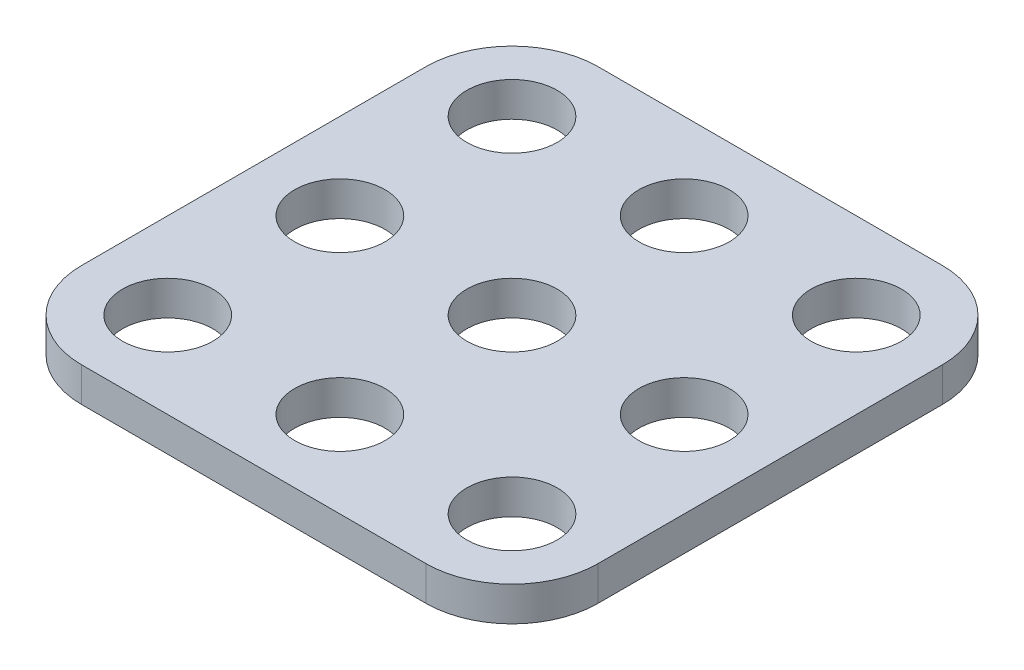
ISO-10303-21;
HEADER;
FILE_DESCRIPTION(('STEP AP214'),'2;1');
FILE_NAME('part.step','',(''),(''),'','','');
FILE_SCHEMA(('AUTOMOTIVE_DESIGN { 1 0 10303 214 1 1 1 1 }'));
ENDSEC;
DATA;
#1=APPLICATION_CONTEXT('core data for automotive mechanical design processes');
#2=APPLICATION_PROTOCOL_DEFINITION('international standard','automotive_design',2000,#1);
#3=PRODUCT_CONTEXT('',#1,'mechanical');
#4=PRODUCT('Part','Part','',(#3));
#5=PRODUCT_RELATED_PRODUCT_CATEGORY('part','',(#4));
#6=PRODUCT_DEFINITION_FORMATION('','',#4);
#7=PRODUCT_DEFINITION_CONTEXT('part definition',#1,'design');
#8=PRODUCT_DEFINITION('design','',#6,#7);
#9=PRODUCT_DEFINITION_SHAPE('','',#8);
#10=(LENGTH_UNIT() NAMED_UNIT(*) SI_UNIT(.MILLI.,.METRE.));
#11=(NAMED_UNIT(*) PLANE_ANGLE_UNIT() SI_UNIT($,.RADIAN.));
#12=(NAMED_UNIT(*) SI_UNIT($,.STERADIAN.) SOLID_ANGLE_UNIT());
#13=UNCERTAINTY_MEASURE_WITH_UNIT(LENGTH_MEASURE(1.E-05),#10,'distance_accuracy_value','');
#14=(GEOMETRIC_REPRESENTATION_CONTEXT(3) GLOBAL_UNCERTAINTY_ASSIGNED_CONTEXT((#13)) GLOBAL_UNIT_ASSIGNED_CONTEXT((#10,
#11,#12)) REPRESENTATION_CONTEXT('',''));
#15=CARTESIAN_POINT('',(0.,0.,0.));
#16=DIRECTION('',(0.,0.,1.));
#17=DIRECTION('',(1.,0.,0.));
#18=AXIS2_PLACEMENT_3D('',#15,#16,#17);
#19=CARTESIAN_POINT('',(0.,-1.6,-25.6));
#20=DIRECTION('',(0.,1.,0.));
#21=DIRECTION('',(0.,0.,1.));
#22=AXIS2_PLACEMENT_3D('',#19,#20,#21);
#23=PLANE('',#22);
#24=CARTESIAN_POINT('',(-12.8,-1.6,-4.8));
#25=DIRECTION('',(0.,1.,0.));
#26=DIRECTION('',(0.,0.,1.));
#27=AXIS2_PLACEMENT_3D('',#24,#25,#26);
#28=CIRCLE('',#27,2.09999999999999);
#29=CARTESIAN_POINT('',(-12.8,-1.6,-2.70000000000001));
#30=VERTEX_POINT('',#29);
#31=EDGE_CURVE('E111',#30,#30,#28,.T.);
#32=ORIENTED_EDGE('',*,*,#31,.T.);
#33=EDGE_LOOP('',(#32));
#34=FACE_BOUND('',#33,.T.);
#35=CARTESIAN_POINT('',(-20.8,-1.6,-4.8));
#36=DIRECTION('',(0.,1.,0.));
#37=DIRECTION('',(0.,0.,1.));
#38=AXIS2_PLACEMENT_3D('',#35,#36,#37);
#39=CIRCLE('',#38,2.09999999999999);
#40=CARTESIAN_POINT('',(-20.8,-1.6,-2.70000000000001));
#41=VERTEX_POINT('',#40);
#42=EDGE_CURVE('E166',#41,#41,#39,.T.);
#43=ORIENTED_EDGE('',*,*,#42,.T.);
#44=EDGE_LOOP('',(#43));
#45=FACE_BOUND('',#44,.T.);
#46=DIRECTION('',(1.,0.,0.));
#47=VECTOR('',#46,1.);
#48=CARTESIAN_POINT('',(-25.6,-1.6,-24.8));
#49=LINE('',#48,#47);
#50=CARTESIAN_POINT('',(-20.8,-1.6,-24.8));
#51=VERTEX_POINT('',#50);
#52=CARTESIAN_POINT('',(-4.8,-1.6,-24.8));
#53=VERTEX_POINT('',#52);
#54=EDGE_CURVE('E82',#51,#53,#49,.T.);
#55=ORIENTED_EDGE('',*,*,#54,.T.);
#56=CARTESIAN_POINT('',(-4.8,-1.6,-20.8));
#57=DIRECTION('',(0.,1.,0.));
#58=DIRECTION('',(0.,0.,1.));
#59=AXIS2_PLACEMENT_3D('',#56,#57,#58);
#60=CIRCLE('',#59,4.);
#61=CARTESIAN_POINT('',(-0.800000000000002,-1.6,-20.8));
#62=VERTEX_POINT('',#61);
#63=EDGE_CURVE('E85',#62,#53,#60,.T.);
#64=ORIENTED_EDGE('',*,*,#63,.F.);
#65=DIRECTION('',(0.,0.,1.));
#66=VECTOR('',#65,1.);
#67=CARTESIAN_POINT('',(-0.8,-1.6,-0.799999999999998));
#68=LINE('',#67,#66);
#69=CARTESIAN_POINT('',(-0.799999999999999,-1.6,-4.8));
#70=VERTEX_POINT('',#69);
#71=EDGE_CURVE('E77',#62,#70,#68,.T.);
#72=ORIENTED_EDGE('',*,*,#71,.T.);
#73=CARTESIAN_POINT('',(-4.8,-1.6,-4.8));
#74=DIRECTION('',(0.,1.,0.));
#75=DIRECTION('',(0.,0.,1.));
#76=AXIS2_PLACEMENT_3D('',#73,#74,#75);
#77=CIRCLE('',#76,4.);
#78=CARTESIAN_POINT('',(-4.8,-1.6,-0.8));
#79=VERTEX_POINT('',#78);
#80=EDGE_CURVE('E157',#79,#70,#77,.T.);
#81=ORIENTED_EDGE('',*,*,#80,.F.);
#82=DIRECTION('',(-1.,0.,0.));
#83=VECTOR('',#82,1.);
#84=CARTESIAN_POINT('',(-25.6,-1.6,-0.8));
#85=LINE('',#84,#83);
#86=CARTESIAN_POINT('',(-20.8,-1.6,-0.8));
#87=VERTEX_POINT('',#86);
#88=EDGE_CURVE('E112',#79,#87,#85,.T.);
#89=ORIENTED_EDGE('',*,*,#88,.T.);
#90=CARTESIAN_POINT('',(-20.8,-1.6,-4.8));
#91=DIRECTION('',(0.,-1.,0.));
#92=DIRECTION('',(0.,0.,-1.));
#93=AXIS2_PLACEMENT_3D('',#90,#91,#92);
#94=CIRCLE('',#93,4.);
#95=CARTESIAN_POINT('',(-24.8,-1.6,-4.8));
#96=VERTEX_POINT('',#95);
#97=EDGE_CURVE('E160',#96,#87,#94,.F.);
#98=ORIENTED_EDGE('',*,*,#97,.F.);
#99=DIRECTION('',(0.,0.,-1.));
#100=VECTOR('',#99,1.);
#101=CARTESIAN_POINT('',(-24.8,-1.6,-0.8));
#102=LINE('',#101,#100);
#103=CARTESIAN_POINT('',(-24.8,-1.6,-20.8));
#104=VERTEX_POINT('',#103);
#105=EDGE_CURVE('E116',#96,#104,#102,.T.);
#106=ORIENTED_EDGE('',*,*,#105,.T.);
#107=CARTESIAN_POINT('',(-20.8,-1.6,-20.8));
#108=DIRECTION('',(0.,1.,0.));
#109=DIRECTION('',(0.,0.,1.));
#110=AXIS2_PLACEMENT_3D('',#107,#108,#109);
#111=CIRCLE('',#110,4.);
#112=EDGE_CURVE('E88',#51,#104,#111,.T.);
#113=ORIENTED_EDGE('',*,*,#112,.F.);
#114=EDGE_LOOP('',(#55,#64,#72,#81,#89,#98,#106,#113));
#115=FACE_BOUND('',#114,.T.);
#116=CARTESIAN_POINT('',(-4.8,-1.6,-4.8));
#117=DIRECTION('',(0.,1.,0.));
#118=DIRECTION('',(0.,0.,1.));
#119=AXIS2_PLACEMENT_3D('',#116,#117,#118);
#120=CIRCLE('',#119,2.09999999999999);
#121=CARTESIAN_POINT('',(-4.8,-1.6,-2.70000000000001));
#122=VERTEX_POINT('',#121);
#123=EDGE_CURVE('E169',#122,#122,#120,.T.);
#124=ORIENTED_EDGE('',*,*,#123,.T.);
#125=EDGE_LOOP('',(#124));
#126=FACE_BOUND('',#125,.T.);
#127=CARTESIAN_POINT('',(-20.8,-1.6,-12.8));
#128=DIRECTION('',(0.,1.,0.));
#129=DIRECTION('',(0.,0.,1.));
#130=AXIS2_PLACEMENT_3D('',#127,#128,#129);
#131=CIRCLE('',#130,2.09999999999999);
#132=CARTESIAN_POINT('',(-20.8,-1.6,-10.7));
#133=VERTEX_POINT('',#132);
#134=EDGE_CURVE('E172',#133,#133,#131,.T.);
#135=ORIENTED_EDGE('',*,*,#134,.T.);
#136=EDGE_LOOP('',(#135));
#137=FACE_BOUND('',#136,.T.);
#138=CARTESIAN_POINT('',(-12.8,-1.6,-12.8));
#139=DIRECTION('',(0.,1.,0.));
#140=DIRECTION('',(0.,0.,1.));
#141=AXIS2_PLACEMENT_3D('',#138,#139,#140);
#142=CIRCLE('',#141,2.09999999999999);
#143=CARTESIAN_POINT('',(-12.8,-1.6,-10.7));
#144=VERTEX_POINT('',#143);
#145=EDGE_CURVE('E175',#144,#144,#142,.T.);
#146=ORIENTED_EDGE('',*,*,#145,.T.);
#147=EDGE_LOOP('',(#146));
#148=FACE_BOUND('',#147,.T.);
#149=CARTESIAN_POINT('',(-4.8,-1.6,-12.8));
#150=DIRECTION('',(0.,1.,0.));
#151=DIRECTION('',(0.,0.,1.));
#152=AXIS2_PLACEMENT_3D('',#149,#150,#151);
#153=CIRCLE('',#152,2.09999999999999);
#154=CARTESIAN_POINT('',(-4.8,-1.6,-10.7));
#155=VERTEX_POINT('',#154);
#156=EDGE_CURVE('E178',#155,#155,#153,.T.);
#157=ORIENTED_EDGE('',*,*,#156,.T.);
#158=EDGE_LOOP('',(#157));
#159=FACE_BOUND('',#158,.T.);
#160=CARTESIAN_POINT('',(-20.8,-1.6,-20.8));
#161=DIRECTION('',(0.,1.,0.));
#162=DIRECTION('',(0.,0.,1.));
#163=AXIS2_PLACEMENT_3D('',#160,#161,#162);
#164=CIRCLE('',#163,2.09999999999999);
#165=CARTESIAN_POINT('',(-20.8,-1.6,-18.7));
#166=VERTEX_POINT('',#165);
#167=EDGE_CURVE('E181',#166,#166,#164,.T.);
#168=ORIENTED_EDGE('',*,*,#167,.T.);
#169=EDGE_LOOP('',(#168));
#170=FACE_BOUND('',#169,.T.);
#171=CARTESIAN_POINT('',(-12.8,-1.6,-20.8));
#172=DIRECTION('',(0.,1.,0.));
#173=DIRECTION('',(0.,0.,1.));
#174=AXIS2_PLACEMENT_3D('',#171,#172,#173);
#175=CIRCLE('',#174,2.09999999999999);
#176=CARTESIAN_POINT('',(-12.8,-1.6,-18.7));
#177=VERTEX_POINT('',#176);
#178=EDGE_CURVE('E183',#177,#177,#175,.T.);
#179=ORIENTED_EDGE('',*,*,#178,.T.);
#180=EDGE_LOOP('',(#179));
#181=FACE_BOUND('',#180,.T.);
#182=CARTESIAN_POINT('',(-4.8,-1.6,-20.8));
#183=DIRECTION('',(0.,1.,0.));
#184=DIRECTION('',(0.,0.,1.));
#185=AXIS2_PLACEMENT_3D('',#182,#183,#184);
#186=CIRCLE('',#185,2.09999999999999);
#187=CARTESIAN_POINT('',(-4.8,-1.6,-18.7));
#188=VERTEX_POINT('',#187);
#189=EDGE_CURVE('E19',#188,#188,#186,.T.);
#190=ORIENTED_EDGE('',*,*,#189,.T.);
#191=EDGE_LOOP('',(#190));
#192=FACE_BOUND('',#191,.T.);
#193=ADVANCED_FACE('F16',(#34,#45,#115,#126,#137,#148,#159,#170,#181,#192),#23,.F.);
#194=CARTESIAN_POINT('',(-4.8,-10.,-20.8));
#195=DIRECTION('',(0.,1.,0.));
#196=DIRECTION('',(0.,0.,1.));
#197=AXIS2_PLACEMENT_3D('',#194,#195,#196);
#198=CYLINDRICAL_SURFACE('',#197,2.09999999999999);
#199=ORIENTED_EDGE('',*,*,#189,.F.);
#200=EDGE_LOOP('',(#199));
#201=FACE_BOUND('',#200,.T.);
#202=CARTESIAN_POINT('',(-4.8,0.,-20.8));
#203=DIRECTION('',(0.,1.,0.));
#204=DIRECTION('',(0.,0.,1.));
#205=AXIS2_PLACEMENT_3D('',#202,#203,#204);
#206=CIRCLE('',#205,2.09999999999999);
#207=CARTESIAN_POINT('',(-4.8,0.,-18.7));
#208=VERTEX_POINT('',#207);
#209=EDGE_CURVE('E153',#208,#208,#206,.F.);
#210=ORIENTED_EDGE('',*,*,#209,.F.);
#211=EDGE_LOOP('',(#210));
#212=FACE_BOUND('',#211,.T.);
#213=ADVANCED_FACE('F191',(#201,#212),#198,.F.);
#214=CARTESIAN_POINT('',(-12.8,-10.,-20.8));
#215=DIRECTION('',(0.,1.,0.));
#216=DIRECTION('',(0.,0.,1.));
#217=AXIS2_PLACEMENT_3D('',#214,#215,#216);
#218=CYLINDRICAL_SURFACE('',#217,2.09999999999999);
#219=ORIENTED_EDGE('',*,*,#178,.F.);
#220=EDGE_LOOP('',(#219));
#221=FACE_BOUND('',#220,.T.);
#222=CARTESIAN_POINT('',(-12.8,0.,-20.8));
#223=DIRECTION('',(0.,1.,0.));
#224=DIRECTION('',(0.,0.,1.));
#225=AXIS2_PLACEMENT_3D('',#222,#223,#224);
#226=CIRCLE('',#225,2.09999999999999);
#227=CARTESIAN_POINT('',(-12.8,0.,-18.7));
#228=VERTEX_POINT('',#227);
#229=EDGE_CURVE('E150',#228,#228,#226,.F.);
#230=ORIENTED_EDGE('',*,*,#229,.F.);
#231=EDGE_LOOP('',(#230));
#232=FACE_BOUND('',#231,.T.);
#233=ADVANCED_FACE('F194',(#221,#232),#218,.F.);
#234=CARTESIAN_POINT('',(-20.8,-10.,-20.8));
#235=DIRECTION('',(0.,1.,0.));
#236=DIRECTION('',(0.,0.,1.));
#237=AXIS2_PLACEMENT_3D('',#234,#235,#236);
#238=CYLINDRICAL_SURFACE('',#237,2.09999999999999);
#239=ORIENTED_EDGE('',*,*,#167,.F.);
#240=EDGE_LOOP('',(#239));
#241=FACE_BOUND('',#240,.T.);
#242=CARTESIAN_POINT('',(-20.8,0.,-20.8));
#243=DIRECTION('',(0.,1.,0.));
#244=DIRECTION('',(0.,0.,1.));
#245=AXIS2_PLACEMENT_3D('',#242,#243,#244);
#246=CIRCLE('',#245,2.09999999999999);
#247=CARTESIAN_POINT('',(-20.8,0.,-18.7));
#248=VERTEX_POINT('',#247);
#249=EDGE_CURVE('E147',#248,#248,#246,.F.);
#250=ORIENTED_EDGE('',*,*,#249,.F.);
#251=EDGE_LOOP('',(#250));
#252=FACE_BOUND('',#251,.T.);
#253=ADVANCED_FACE('F256',(#241,#252),#238,.F.);
#254=CARTESIAN_POINT('',(-4.8,-10.,-12.8));
#255=DIRECTION('',(0.,1.,0.));
#256=DIRECTION('',(0.,0.,1.));
#257=AXIS2_PLACEMENT_3D('',#254,#255,#256);
#258=CYLINDRICAL_SURFACE('',#257,2.09999999999999);
#259=ORIENTED_EDGE('',*,*,#156,.F.);
#260=EDGE_LOOP('',(#259));
#261=FACE_BOUND('',#260,.T.);
#262=CARTESIAN_POINT('',(-4.8,0.,-12.8));
#263=DIRECTION('',(0.,1.,0.));
#264=DIRECTION('',(0.,0.,1.));
#265=AXIS2_PLACEMENT_3D('',#262,#263,#264);
#266=CIRCLE('',#265,2.09999999999999);
#267=CARTESIAN_POINT('',(-4.8,0.,-10.7));
#268=VERTEX_POINT('',#267);
#269=EDGE_CURVE('E144',#268,#268,#266,.F.);
#270=ORIENTED_EDGE('',*,*,#269,.F.);
#271=EDGE_LOOP('',(#270));
#272=FACE_BOUND('',#271,.T.);
#273=ADVANCED_FACE('F252',(#261,#272),#258,.F.);
#274=CARTESIAN_POINT('',(-12.8,-10.,-12.8));
#275=DIRECTION('',(0.,1.,0.));
#276=DIRECTION('',(0.,0.,1.));
#277=AXIS2_PLACEMENT_3D('',#274,#275,#276);
#278=CYLINDRICAL_SURFACE('',#277,2.09999999999999);
#279=ORIENTED_EDGE('',*,*,#145,.F.);
#280=EDGE_LOOP('',(#279));
#281=FACE_BOUND('',#280,.T.);
#282=CARTESIAN_POINT('',(-12.8,0.,-12.8));
#283=DIRECTION('',(0.,1.,0.));
#284=DIRECTION('',(0.,0.,1.));
#285=AXIS2_PLACEMENT_3D('',#282,#283,#284);
#286=CIRCLE('',#285,2.09999999999999);
#287=CARTESIAN_POINT('',(-12.8,0.,-10.7));
#288=VERTEX_POINT('',#287);
#289=EDGE_CURVE('E141',#288,#288,#286,.F.);
#290=ORIENTED_EDGE('',*,*,#289,.F.);
#291=EDGE_LOOP('',(#290));
#292=FACE_BOUND('',#291,.T.);
#293=ADVANCED_FACE('F248',(#281,#292),#278,.F.);
#294=CARTESIAN_POINT('',(-20.8,-10.,-12.8));
#295=DIRECTION('',(0.,1.,0.));
#296=DIRECTION('',(0.,0.,1.));
#297=AXIS2_PLACEMENT_3D('',#294,#295,#296);
#298=CYLINDRICAL_SURFACE('',#297,2.09999999999999);
#299=ORIENTED_EDGE('',*,*,#134,.F.);
#300=EDGE_LOOP('',(#299));
#301=FACE_BOUND('',#300,.T.);
#302=CARTESIAN_POINT('',(-20.8,0.,-12.8));
#303=DIRECTION('',(0.,1.,0.));
#304=DIRECTION('',(0.,0.,1.));
#305=AXIS2_PLACEMENT_3D('',#302,#303,#304);
#306=CIRCLE('',#305,2.09999999999999);
#307=CARTESIAN_POINT('',(-20.8,0.,-10.7));
#308=VERTEX_POINT('',#307);
#309=EDGE_CURVE('E138',#308,#308,#306,.F.);
#310=ORIENTED_EDGE('',*,*,#309,.F.);
#311=EDGE_LOOP('',(#310));
#312=FACE_BOUND('',#311,.T.);
#313=ADVANCED_FACE('F244',(#301,#312),#298,.F.);
#314=CARTESIAN_POINT('',(-4.8,-10.,-4.8));
#315=DIRECTION('',(0.,1.,0.));
#316=DIRECTION('',(0.,0.,1.));
#317=AXIS2_PLACEMENT_3D('',#314,#315,#316);
#318=CYLINDRICAL_SURFACE('',#317,2.09999999999999);
#319=ORIENTED_EDGE('',*,*,#123,.F.);
#320=EDGE_LOOP('',(#319));
#321=FACE_BOUND('',#320,.T.);
#322=CARTESIAN_POINT('',(-4.8,0.,-4.8));
#323=DIRECTION('',(0.,1.,0.));
#324=DIRECTION('',(0.,0.,1.));
#325=AXIS2_PLACEMENT_3D('',#322,#323,#324);
#326=CIRCLE('',#325,2.09999999999999);
#327=CARTESIAN_POINT('',(-4.8,0.,-2.70000000000001));
#328=VERTEX_POINT('',#327);
#329=EDGE_CURVE('E135',#328,#328,#326,.F.);
#330=ORIENTED_EDGE('',*,*,#329,.F.);
#331=EDGE_LOOP('',(#330));
#332=FACE_BOUND('',#331,.T.);
#333=ADVANCED_FACE('F240',(#321,#332),#318,.F.);
#334=CARTESIAN_POINT('',(-20.8,-10.,-4.8));
#335=DIRECTION('',(0.,1.,0.));
#336=DIRECTION('',(0.,0.,1.));
#337=AXIS2_PLACEMENT_3D('',#334,#335,#336);
#338=CYLINDRICAL_SURFACE('',#337,2.09999999999999);
#339=ORIENTED_EDGE('',*,*,#42,.F.);
#340=EDGE_LOOP('',(#339));
#341=FACE_BOUND('',#340,.T.);
#342=CARTESIAN_POINT('',(-20.8,0.,-4.8));
#343=DIRECTION('',(0.,1.,0.));
#344=DIRECTION('',(0.,0.,1.));
#345=AXIS2_PLACEMENT_3D('',#342,#343,#344);
#346=CIRCLE('',#345,2.09999999999999);
#347=CARTESIAN_POINT('',(-20.8,0.,-2.70000000000001));
#348=VERTEX_POINT('',#347);
#349=EDGE_CURVE('E132',#348,#348,#346,.F.);
#350=ORIENTED_EDGE('',*,*,#349,.F.);
#351=EDGE_LOOP('',(#350));
#352=FACE_BOUND('',#351,.T.);
#353=ADVANCED_FACE('F236',(#341,#352),#338,.F.);
#354=CARTESIAN_POINT('',(-12.8,-10.,-4.8));
#355=DIRECTION('',(0.,1.,0.));
#356=DIRECTION('',(0.,0.,1.));
#357=AXIS2_PLACEMENT_3D('',#354,#355,#356);
#358=CYLINDRICAL_SURFACE('',#357,2.09999999999999);
#359=ORIENTED_EDGE('',*,*,#31,.F.);
#360=EDGE_LOOP('',(#359));
#361=FACE_BOUND('',#360,.T.);
#362=CARTESIAN_POINT('',(-12.8,0.,-4.8));
#363=DIRECTION('',(0.,1.,0.));
#364=DIRECTION('',(0.,0.,1.));
#365=AXIS2_PLACEMENT_3D('',#362,#363,#364);
#366=CIRCLE('',#365,2.09999999999999);
#367=CARTESIAN_POINT('',(-12.8,0.,-2.70000000000001));
#368=VERTEX_POINT('',#367);
#369=EDGE_CURVE('E129',#368,#368,#366,.F.);
#370=ORIENTED_EDGE('',*,*,#369,.F.);
#371=EDGE_LOOP('',(#370));
#372=FACE_BOUND('',#371,.T.);
#373=ADVANCED_FACE('F233',(#361,#372),#358,.F.);
#374=CARTESIAN_POINT('',(-0.8,-10.,-0.799999999999998));
#375=DIRECTION('',(-1.,0.,0.));
#376=DIRECTION('',(0.,0.,1.));
#377=AXIS2_PLACEMENT_3D('',#374,#375,#376);
#378=PLANE('',#377);
#379=DIRECTION('',(0.,0.,1.));
#380=VECTOR('',#379,1.);
#381=CARTESIAN_POINT('',(-0.8,0.,-25.6));
#382=LINE('',#381,#380);
#383=CARTESIAN_POINT('',(-0.8,0.,-4.8));
#384=VERTEX_POINT('',#383);
#385=CARTESIAN_POINT('',(-0.800000000000001,0.,-20.8));
#386=VERTEX_POINT('',#385);
#387=EDGE_CURVE('E128',#384,#386,#382,.F.);
#388=ORIENTED_EDGE('',*,*,#387,.F.);
#389=DIRECTION('',(0.,1.,0.));
#390=VECTOR('',#389,1.);
#391=CARTESIAN_POINT('',(-0.799999999999999,-10.,-4.8));
#392=LINE('',#391,#390);
#393=EDGE_CURVE('E156',#70,#384,#392,.T.);
#394=ORIENTED_EDGE('',*,*,#393,.F.);
#395=ORIENTED_EDGE('',*,*,#71,.F.);
#396=DIRECTION('',(0.,1.,0.));
#397=VECTOR('',#396,1.);
#398=CARTESIAN_POINT('',(-0.800000000000002,-10.,-20.8));
#399=LINE('',#398,#397);
#400=EDGE_CURVE('E98',#386,#62,#399,.F.);
#401=ORIENTED_EDGE('',*,*,#400,.F.);
#402=EDGE_LOOP('',(#388,#394,#395,#401));
#403=FACE_BOUND('',#402,.T.);
#404=ADVANCED_FACE('F230',(#403),#378,.F.);
#405=CARTESIAN_POINT('',(-4.8,-10.,-20.8));
#406=DIRECTION('',(0.,1.,0.));
#407=DIRECTION('',(0.,0.,1.));
#408=AXIS2_PLACEMENT_3D('',#405,#406,#407);
#409=CYLINDRICAL_SURFACE('',#408,4.);
#410=ORIENTED_EDGE('',*,*,#63,.T.);
#411=DIRECTION('',(0.,1.,0.));
#412=VECTOR('',#411,1.);
#413=CARTESIAN_POINT('',(-4.8,-10.,-24.8));
#414=LINE('',#413,#412);
#415=CARTESIAN_POINT('',(-4.8,0.,-24.8));
#416=VERTEX_POINT('',#415);
#417=EDGE_CURVE('E92',#53,#416,#414,.T.);
#418=ORIENTED_EDGE('',*,*,#417,.T.);
#419=CARTESIAN_POINT('',(-4.8,0.,-20.8));
#420=DIRECTION('',(0.,1.,0.));
#421=DIRECTION('',(0.,0.,1.));
#422=AXIS2_PLACEMENT_3D('',#419,#420,#421);
#423=CIRCLE('',#422,4.);
#424=EDGE_CURVE('E126',#386,#416,#423,.T.);
#425=ORIENTED_EDGE('',*,*,#424,.F.);
#426=ORIENTED_EDGE('',*,*,#400,.T.);
#427=EDGE_LOOP('',(#410,#418,#425,#426));
#428=FACE_BOUND('',#427,.T.);
#429=ADVANCED_FACE('F95',(#428),#409,.T.);
#430=CARTESIAN_POINT('',(-25.6,-10.,-24.8));
#431=DIRECTION('',(0.,0.,1.));
#432=DIRECTION('',(1.,0.,0.));
#433=AXIS2_PLACEMENT_3D('',#430,#431,#432);
#434=PLANE('',#433);
#435=DIRECTION('',(1.,0.,0.));
#436=VECTOR('',#435,1.);
#437=CARTESIAN_POINT('',(0.,0.,-24.8));
#438=LINE('',#437,#436);
#439=CARTESIAN_POINT('',(-20.8,0.,-24.8));
#440=VERTEX_POINT('',#439);
#441=EDGE_CURVE('E102',#416,#440,#438,.F.);
#442=ORIENTED_EDGE('',*,*,#441,.F.);
#443=ORIENTED_EDGE('',*,*,#417,.F.);
#444=ORIENTED_EDGE('',*,*,#54,.F.);
#445=DIRECTION('',(0.,1.,0.));
#446=VECTOR('',#445,1.);
#447=CARTESIAN_POINT('',(-20.8,-10.,-24.8));
#448=LINE('',#447,#446);
#449=EDGE_CURVE('E104',#440,#51,#448,.F.);
#450=ORIENTED_EDGE('',*,*,#449,.F.);
#451=EDGE_LOOP('',(#442,#443,#444,#450));
#452=FACE_BOUND('',#451,.T.);
#453=ADVANCED_FACE('F100',(#452),#434,.F.);
#454=CARTESIAN_POINT('',(-20.8,-10.,-20.8));
#455=DIRECTION('',(0.,1.,0.));
#456=DIRECTION('',(0.,0.,1.));
#457=AXIS2_PLACEMENT_3D('',#454,#455,#456);
#458=CYLINDRICAL_SURFACE('',#457,4.);
#459=ORIENTED_EDGE('',*,*,#112,.T.);
#460=DIRECTION('',(0.,1.,0.));
#461=VECTOR('',#460,1.);
#462=CARTESIAN_POINT('',(-24.8,-10.,-20.8));
#463=LINE('',#462,#461);
#464=CARTESIAN_POINT('',(-24.8,0.,-20.8));
#465=VERTEX_POINT('',#464);
#466=EDGE_CURVE('E117',#104,#465,#463,.T.);
#467=ORIENTED_EDGE('',*,*,#466,.T.);
#468=CARTESIAN_POINT('',(-20.8,0.,-20.8));
#469=DIRECTION('',(0.,1.,0.));
#470=DIRECTION('',(0.,0.,1.));
#471=AXIS2_PLACEMENT_3D('',#468,#469,#470);
#472=CIRCLE('',#471,4.);
#473=EDGE_CURVE('E123',#440,#465,#472,.T.);
#474=ORIENTED_EDGE('',*,*,#473,.F.);
#475=ORIENTED_EDGE('',*,*,#449,.T.);
#476=EDGE_LOOP('',(#459,#467,#474,#475));
#477=FACE_BOUND('',#476,.T.);
#478=ADVANCED_FACE('F221',(#477),#458,.T.);
#479=CARTESIAN_POINT('',(-24.8,-10.,-0.8));
#480=DIRECTION('',(1.,0.,0.));
#481=DIRECTION('',(0.,0.,-1.));
#482=AXIS2_PLACEMENT_3D('',#479,#480,#481);
#483=PLANE('',#482);
#484=ORIENTED_EDGE('',*,*,#105,.F.);
#485=DIRECTION('',(0.,-1.,0.));
#486=VECTOR('',#485,1.);
#487=CARTESIAN_POINT('',(-24.8,-10.,-4.8));
#488=LINE('',#487,#486);
#489=CARTESIAN_POINT('',(-24.8,0.,-4.8));
#490=VERTEX_POINT('',#489);
#491=EDGE_CURVE('E115',#490,#96,#488,.T.);
#492=ORIENTED_EDGE('',*,*,#491,.F.);
#493=DIRECTION('',(0.,0.,1.));
#494=VECTOR('',#493,1.);
#495=CARTESIAN_POINT('',(-24.8,0.,-25.6));
#496=LINE('',#495,#494);
#497=EDGE_CURVE('E122',#465,#490,#496,.T.);
#498=ORIENTED_EDGE('',*,*,#497,.F.);
#499=ORIENTED_EDGE('',*,*,#466,.F.);
#500=EDGE_LOOP('',(#484,#492,#498,#499));
#501=FACE_BOUND('',#500,.T.);
#502=ADVANCED_FACE('F217',(#501),#483,.F.);
#503=CARTESIAN_POINT('',(-20.8,-10.,-4.8));
#504=DIRECTION('',(0.,-1.,0.));
#505=DIRECTION('',(0.,0.,-1.));
#506=AXIS2_PLACEMENT_3D('',#503,#504,#505);
#507=CYLINDRICAL_SURFACE('',#506,4.);
#508=CARTESIAN_POINT('',(-20.8,0.,-4.8));
#509=DIRECTION('',(0.,-1.,0.));
#510=DIRECTION('',(0.,0.,-1.));
#511=AXIS2_PLACEMENT_3D('',#508,#509,#510);
#512=CIRCLE('',#511,4.);
#513=CARTESIAN_POINT('',(-20.8,0.,-0.799999999999999));
#514=VERTEX_POINT('',#513);
#515=EDGE_CURVE('E119',#490,#514,#512,.F.);
#516=ORIENTED_EDGE('',*,*,#515,.F.);
#517=ORIENTED_EDGE('',*,*,#491,.T.);
#518=ORIENTED_EDGE('',*,*,#97,.T.);
#519=DIRECTION('',(0.,1.,0.));
#520=VECTOR('',#519,1.);
#521=CARTESIAN_POINT('',(-20.8,-10.,-0.8));
#522=LINE('',#521,#520);
#523=EDGE_CURVE('E114',#87,#514,#522,.T.);
#524=ORIENTED_EDGE('',*,*,#523,.T.);
#525=EDGE_LOOP('',(#516,#517,#518,#524));
#526=FACE_BOUND('',#525,.T.);
#527=ADVANCED_FACE('F214',(#526),#507,.T.);
#528=CARTESIAN_POINT('',(-25.6,-10.,-0.8));
#529=DIRECTION('',(0.,0.,-1.));
#530=DIRECTION('',(-1.,0.,0.));
#531=AXIS2_PLACEMENT_3D('',#528,#529,#530);
#532=PLANE('',#531);
#533=DIRECTION('',(1.,0.,0.));
#534=VECTOR('',#533,1.);
#535=CARTESIAN_POINT('',(0.,0.,-0.799999999999999));
#536=LINE('',#535,#534);
#537=CARTESIAN_POINT('',(-4.8,0.,-0.799999999999999));
#538=VERTEX_POINT('',#537);
#539=EDGE_CURVE('E25',#514,#538,#536,.T.);
#540=ORIENTED_EDGE('',*,*,#539,.F.);
#541=ORIENTED_EDGE('',*,*,#523,.F.);
#542=ORIENTED_EDGE('',*,*,#88,.F.);
#543=DIRECTION('',(0.,1.,0.));
#544=VECTOR('',#543,1.);
#545=CARTESIAN_POINT('',(-4.8,-10.,-0.8));
#546=LINE('',#545,#544);
#547=EDGE_CURVE('E34',#538,#79,#546,.F.);
#548=ORIENTED_EDGE('',*,*,#547,.F.);
#549=EDGE_LOOP('',(#540,#541,#542,#548));
#550=FACE_BOUND('',#549,.T.);
#551=ADVANCED_FACE('F206',(#550),#532,.F.);
#552=CARTESIAN_POINT('',(-4.8,-10.,-4.8));
#553=DIRECTION('',(0.,1.,0.));
#554=DIRECTION('',(0.,0.,1.));
#555=AXIS2_PLACEMENT_3D('',#552,#553,#554);
#556=CYLINDRICAL_SURFACE('',#555,4.);
#557=ORIENTED_EDGE('',*,*,#80,.T.);
#558=ORIENTED_EDGE('',*,*,#393,.T.);
#559=CARTESIAN_POINT('',(-4.8,0.,-4.8));
#560=DIRECTION('',(0.,1.,0.));
#561=DIRECTION('',(0.,0.,1.));
#562=AXIS2_PLACEMENT_3D('',#559,#560,#561);
#563=CIRCLE('',#562,4.);
#564=EDGE_CURVE('E9',#538,#384,#563,.T.);
#565=ORIENTED_EDGE('',*,*,#564,.F.);
#566=ORIENTED_EDGE('',*,*,#547,.T.);
#567=EDGE_LOOP('',(#557,#558,#565,#566));
#568=FACE_BOUND('',#567,.T.);
#569=ADVANCED_FACE('F199',(#568),#556,.T.);
#570=CARTESIAN_POINT('',(0.,0.,-25.6));
#571=DIRECTION('',(0.,1.,0.));
#572=DIRECTION('',(0.,0.,1.));
#573=AXIS2_PLACEMENT_3D('',#570,#571,#572);
#574=PLANE('',#573);
#575=ORIENTED_EDGE('',*,*,#539,.T.);
#576=ORIENTED_EDGE('',*,*,#564,.T.);
#577=ORIENTED_EDGE('',*,*,#387,.T.);
#578=ORIENTED_EDGE('',*,*,#424,.T.);
#579=ORIENTED_EDGE('',*,*,#441,.T.);
#580=ORIENTED_EDGE('',*,*,#473,.T.);
#581=ORIENTED_EDGE('',*,*,#497,.T.);
#582=ORIENTED_EDGE('',*,*,#515,.T.);
#583=EDGE_LOOP('',(#575,#576,#577,#578,#579,#580,#581,#582));
#584=FACE_BOUND('',#583,.T.);
#585=ORIENTED_EDGE('',*,*,#369,.T.);
#586=EDGE_LOOP('',(#585));
#587=FACE_BOUND('',#586,.T.);
#588=ORIENTED_EDGE('',*,*,#349,.T.);
#589=EDGE_LOOP('',(#588));
#590=FACE_BOUND('',#589,.T.);
#591=ORIENTED_EDGE('',*,*,#329,.T.);
#592=EDGE_LOOP('',(#591));
#593=FACE_BOUND('',#592,.T.);
#594=ORIENTED_EDGE('',*,*,#309,.T.);
#595=EDGE_LOOP('',(#594));
#596=FACE_BOUND('',#595,.T.);
#597=ORIENTED_EDGE('',*,*,#289,.T.);
#598=EDGE_LOOP('',(#597));
#599=FACE_BOUND('',#598,.T.);
#600=ORIENTED_EDGE('',*,*,#269,.T.);
#601=EDGE_LOOP('',(#600));
#602=FACE_BOUND('',#601,.T.);
#603=ORIENTED_EDGE('',*,*,#249,.T.);
#604=EDGE_LOOP('',(#603));
#605=FACE_BOUND('',#604,.T.);
#606=ORIENTED_EDGE('',*,*,#229,.T.);
#607=EDGE_LOOP('',(#606));
#608=FACE_BOUND('',#607,.T.);
#609=ORIENTED_EDGE('',*,*,#209,.T.);
#610=EDGE_LOOP('',(#609));
#611=FACE_BOUND('',#610,.T.);
#612=ADVANCED_FACE('F197',(#584,#587,#590,#593,#596,#599,#602,#605,#608,#611),#574,.T.);
#613=CLOSED_SHELL('',(#193,#213,#233,#253,#273,#293,#313,#333,#353,#373,#404,#429,#453,#478,
#502,#527,#551,#569,#612));
#614=MANIFOLD_SOLID_BREP('B1',#613);
#615=ADVANCED_BREP_SHAPE_REPRESENTATION('',(#18,#614),#14);
#616=SHAPE_DEFINITION_REPRESENTATION(#9,#615);
ENDSEC;
END-ISO-10303-21;
